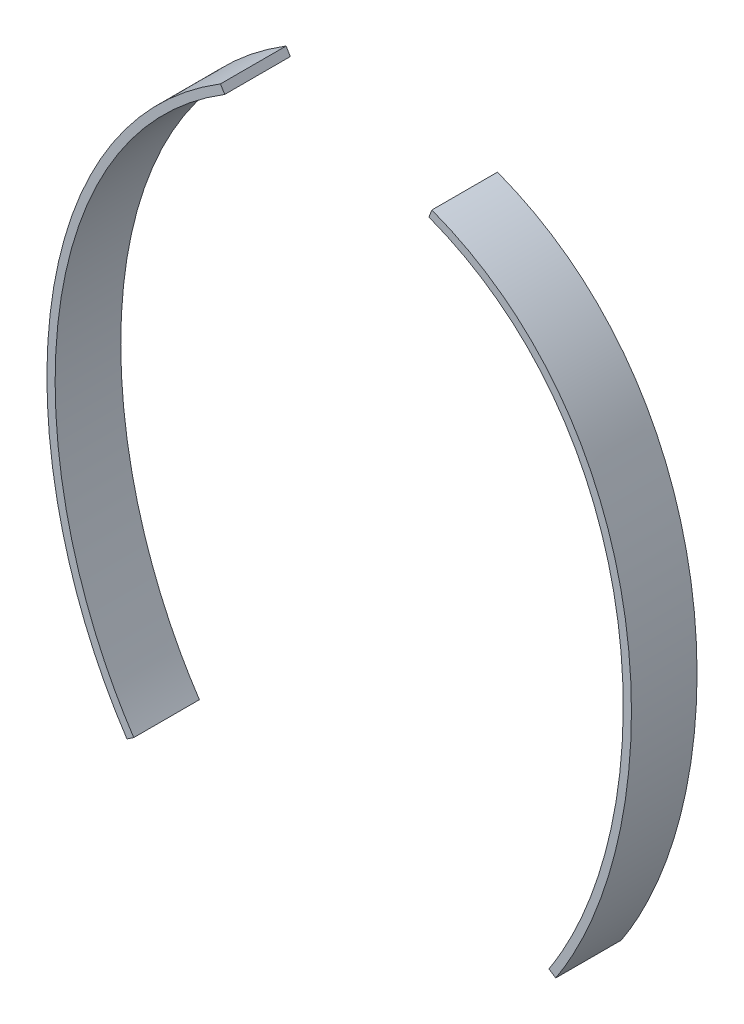
ISO-10303-21;
HEADER;
FILE_DESCRIPTION(('STEP AP214'),'2;1');
FILE_NAME('part.step','',(''),(''),'','','');
FILE_SCHEMA(('AUTOMOTIVE_DESIGN { 1 0 10303 214 1 1 1 1 }'));
ENDSEC;
DATA;
#1=APPLICATION_CONTEXT('core data for automotive mechanical design processes');
#2=APPLICATION_PROTOCOL_DEFINITION('international standard','automotive_design',2000,#1);
#3=PRODUCT_CONTEXT('',#1,'mechanical');
#4=PRODUCT('Part','Part','',(#3));
#5=PRODUCT_RELATED_PRODUCT_CATEGORY('part','',(#4));
#6=PRODUCT_DEFINITION_FORMATION('','',#4);
#7=PRODUCT_DEFINITION_CONTEXT('part definition',#1,'design');
#8=PRODUCT_DEFINITION('design','',#6,#7);
#9=PRODUCT_DEFINITION_SHAPE('','',#8);
#10=(LENGTH_UNIT() NAMED_UNIT(*) SI_UNIT(.MILLI.,.METRE.));
#11=(NAMED_UNIT(*) PLANE_ANGLE_UNIT() SI_UNIT($,.RADIAN.));
#12=(NAMED_UNIT(*) SI_UNIT($,.STERADIAN.) SOLID_ANGLE_UNIT());
#13=UNCERTAINTY_MEASURE_WITH_UNIT(LENGTH_MEASURE(1.E-05),#10,'distance_accuracy_value','');
#14=(GEOMETRIC_REPRESENTATION_CONTEXT(3) GLOBAL_UNCERTAINTY_ASSIGNED_CONTEXT((#13)) GLOBAL_UNIT_ASSIGNED_CONTEXT((#10,
#11,#12)) REPRESENTATION_CONTEXT('',''));
#15=CARTESIAN_POINT('',(0.,0.,0.));
#16=DIRECTION('',(0.,0.,1.));
#17=DIRECTION('',(1.,0.,0.));
#18=AXIS2_PLACEMENT_3D('',#15,#16,#17);
#19=CARTESIAN_POINT('',(21.9850501323743,52.8474394548477,201.));
#20=CARTESIAN_POINT('',(28.9641754913732,50.1960730306956,201.));
#21=CARTESIAN_POINT('',(35.0807872943287,46.6568559694011,201.));
#22=CARTESIAN_POINT('',(45.7290633469079,38.152328712859,201.));
#23=CARTESIAN_POINT('',(50.2613665562495,33.1854006876494,201.));
#24=CARTESIAN_POINT('',(57.8464524060081,22.1554386040819,201.));
#25=CARTESIAN_POINT('',(60.8981981202892,16.0918796897056,201.));
#26=CARTESIAN_POINT('',(65.5992221508379,3.22070987088875,201.));
#27=CARTESIAN_POINT('',(67.247969533013,-3.58648761186403,201.));
#28=CARTESIAN_POINT('',(70.2081637312982,-24.5654757786121,201.));
#29=CARTESIAN_POINT('',(69.5296472071106,-39.294325970111,201.));
#30=CARTESIAN_POINT('',(65.0805181526428,-60.2240674218553,201.));
#31=CARTESIAN_POINT('',(63.0264719985509,-67.0064996092342,201.));
#32=CARTESIAN_POINT('',(57.8786663488817,-79.8036423821645,201.));
#33=CARTESIAN_POINT('',(54.7848324065976,-85.8181336338963,201.));
#34=CARTESIAN_POINT('',(51.2269154824773,-91.2611666180093,201.));
#35=B_SPLINE_CURVE_WITH_KNOTS('',3,(#19,#20,#21,#22,#23,#24,#25,#26,#27,#28,#29,#30,#31,#32,#33,
#34),.UNSPECIFIED.,.F.,.F.,(4,2,2,2,2,2,2,4),(0.,0.125,0.25,0.375,0.5,0.75,0.875,1.),.UNSPECIFIED.);
#36=DIRECTION('',(0.,0.,-1.));
#37=VECTOR('',#36,1.);
#38=SURFACE_OF_LINEAR_EXTRUSION('',#35,#37);
#39=CARTESIAN_POINT('',(21.9850501323743,52.8474394548477,185.));
#40=CARTESIAN_POINT('',(28.9641754913732,50.1960730306956,185.));
#41=CARTESIAN_POINT('',(35.0807872943287,46.6568559694011,185.));
#42=CARTESIAN_POINT('',(45.7290633469079,38.152328712859,185.));
#43=CARTESIAN_POINT('',(50.2613665562495,33.1854006876494,185.));
#44=CARTESIAN_POINT('',(57.8464524060081,22.1554386040819,185.));
#45=CARTESIAN_POINT('',(60.8981981202892,16.0918796897056,185.));
#46=CARTESIAN_POINT('',(65.5992221508379,3.22070987088875,185.));
#47=CARTESIAN_POINT('',(67.247969533013,-3.58648761186403,185.));
#48=CARTESIAN_POINT('',(70.2081637312982,-24.5654757786121,185.));
#49=CARTESIAN_POINT('',(69.5296472071106,-39.294325970111,185.));
#50=CARTESIAN_POINT('',(65.0805181526428,-60.2240674218553,185.));
#51=CARTESIAN_POINT('',(63.0264719985509,-67.0064996092342,185.));
#52=CARTESIAN_POINT('',(57.8786663488817,-79.8036423821645,185.));
#53=CARTESIAN_POINT('',(54.7848324065976,-85.8181336338963,185.));
#54=CARTESIAN_POINT('',(51.2269154824773,-91.2611666180093,185.));
#55=B_SPLINE_CURVE_WITH_KNOTS('',3,(#39,#40,#41,#42,#43,#44,#45,#46,#47,#48,#49,#50,#51,#52,#53,
#54),.UNSPECIFIED.,.F.,.F.,(4,2,2,2,2,2,2,4),(0.,0.125,0.25,0.375,0.5,0.75,0.875,1.),.UNSPECIFIED.);
#56=CARTESIAN_POINT('',(21.9850501323743,52.8474394548477,185.));
#57=VERTEX_POINT('',#56);
#58=CARTESIAN_POINT('',(51.2269154824773,-91.2611666180093,185.));
#59=VERTEX_POINT('',#58);
#60=EDGE_CURVE('E124',#57,#59,#55,.T.);
#61=ORIENTED_EDGE('',*,*,#60,.T.);
#62=DIRECTION('',(0.,0.,-1.));
#63=VECTOR('',#62,1.);
#64=CARTESIAN_POINT('',(51.2269154824773,-91.2611666180093,201.));
#65=LINE('',#64,#63);
#66=CARTESIAN_POINT('',(51.2269154824773,-91.2611666180093,201.));
#67=VERTEX_POINT('',#66);
#68=EDGE_CURVE('E12',#67,#59,#65,.T.);
#69=ORIENTED_EDGE('',*,*,#68,.F.);
#70=CARTESIAN_POINT('',(21.9850501323743,52.8474394548477,201.));
#71=VERTEX_POINT('',#70);
#72=EDGE_CURVE('E85',#71,#67,#35,.T.);
#73=ORIENTED_EDGE('',*,*,#72,.F.);
#74=DIRECTION('',(0.,0.,-1.));
#75=VECTOR('',#74,1.);
#76=CARTESIAN_POINT('',(21.9850501323743,52.8474394548477,201.));
#77=LINE('',#76,#75);
#78=EDGE_CURVE('E61',#71,#57,#77,.T.);
#79=ORIENTED_EDGE('',*,*,#78,.T.);
#80=EDGE_LOOP('',(#61,#69,#73,#79));
#81=FACE_BOUND('',#80,.T.);
#82=ADVANCED_FACE('F44',(#81),#38,.F.);
#83=CARTESIAN_POINT('',(52.9009940572317,-92.355452195703,201.));
#84=DIRECTION('',(-0.547142788846836,-0.837039287377186,0.));
#85=DIRECTION('',(0.837039287377186,-0.547142788846836,0.));
#86=AXIS2_PLACEMENT_3D('',#83,#84,#85);
#87=PLANE('',#86);
#88=DIRECTION('',(-0.837039287377186,0.547142788846836,0.));
#89=VECTOR('',#88,1.);
#90=CARTESIAN_POINT('',(52.9009940572317,-92.355452195703,185.));
#91=LINE('',#90,#89);
#92=CARTESIAN_POINT('',(52.9009940572317,-92.355452195703,185.));
#93=VERTEX_POINT('',#92);
#94=EDGE_CURVE('E94',#93,#59,#91,.T.);
#95=ORIENTED_EDGE('',*,*,#94,.F.);
#96=DIRECTION('',(0.,0.,-1.));
#97=VECTOR('',#96,1.);
#98=CARTESIAN_POINT('',(52.9009940572317,-92.355452195703,201.));
#99=LINE('',#98,#97);
#100=CARTESIAN_POINT('',(52.9009940572317,-92.355452195703,201.));
#101=VERTEX_POINT('',#100);
#102=EDGE_CURVE('E53',#101,#93,#99,.T.);
#103=ORIENTED_EDGE('',*,*,#102,.F.);
#104=DIRECTION('',(-0.837039287377186,0.547142788846836,0.));
#105=VECTOR('',#104,1.);
#106=CARTESIAN_POINT('',(52.9009940572317,-92.355452195703,201.));
#107=LINE('',#106,#105);
#108=EDGE_CURVE('E92',#101,#67,#107,.T.);
#109=ORIENTED_EDGE('',*,*,#108,.T.);
#110=ORIENTED_EDGE('',*,*,#68,.T.);
#111=EDGE_LOOP('',(#95,#103,#109,#110));
#112=FACE_BOUND('',#111,.T.);
#113=ADVANCED_FACE('F91',(#112),#87,.T.);
#114=CARTESIAN_POINT('',(22.6953215064285,54.7170689837114,201.));
#115=CARTESIAN_POINT('',(80.0483874143488,32.9286663618312,201.));
#116=CARTESIAN_POINT('',(81.9930630964623,-47.8493283221736,201.));
#117=CARTESIAN_POINT('',(52.9009940572317,-92.355452195703,201.));
#118=B_SPLINE_CURVE_WITH_KNOTS('',3,(#114,#115,#116,#117),.UNSPECIFIED.,.F.,.F.,(4,4),(0.,1.),.UNSPECIFIED.);
#119=DIRECTION('',(0.,0.,-1.));
#120=VECTOR('',#119,1.);
#121=SURFACE_OF_LINEAR_EXTRUSION('',#118,#120);
#122=CARTESIAN_POINT('',(22.6953215064285,54.7170689837114,185.));
#123=CARTESIAN_POINT('',(80.0483874143488,32.9286663618312,185.));
#124=CARTESIAN_POINT('',(81.9930630964623,-47.8493283221736,185.));
#125=CARTESIAN_POINT('',(52.9009940572317,-92.355452195703,185.));
#126=B_SPLINE_CURVE_WITH_KNOTS('',3,(#122,#123,#124,#125),.UNSPECIFIED.,.F.,.F.,(4,4),(0.,1.),.UNSPECIFIED.);
#127=CARTESIAN_POINT('',(22.6953215064285,54.7170689837114,185.));
#128=VERTEX_POINT('',#127);
#129=EDGE_CURVE('E128',#128,#93,#126,.T.);
#130=ORIENTED_EDGE('',*,*,#129,.F.);
#131=DIRECTION('',(0.,0.,-1.));
#132=VECTOR('',#131,1.);
#133=CARTESIAN_POINT('',(22.6953215064285,54.7170689837114,201.));
#134=LINE('',#133,#132);
#135=CARTESIAN_POINT('',(22.6953215064285,54.7170689837114,201.));
#136=VERTEX_POINT('',#135);
#137=EDGE_CURVE('E74',#136,#128,#134,.T.);
#138=ORIENTED_EDGE('',*,*,#137,.F.);
#139=EDGE_CURVE('E100',#136,#101,#118,.T.);
#140=ORIENTED_EDGE('',*,*,#139,.T.);
#141=ORIENTED_EDGE('',*,*,#102,.T.);
#142=EDGE_LOOP('',(#130,#138,#140,#141));
#143=FACE_BOUND('',#142,.T.);
#144=ADVANCED_FACE('F102',(#143),#121,.T.);
#145=CARTESIAN_POINT('',(21.9850501323743,52.8474394548477,201.));
#146=DIRECTION('',(-0.93481476443186,0.355135687027094,0.));
#147=DIRECTION('',(-0.355135687027094,-0.93481476443186,0.));
#148=AXIS2_PLACEMENT_3D('',#145,#146,#147);
#149=PLANE('',#148);
#150=DIRECTION('',(0.355135687027094,0.93481476443186,0.));
#151=VECTOR('',#150,1.);
#152=CARTESIAN_POINT('',(21.9850501323743,52.8474394548477,185.));
#153=LINE('',#152,#151);
#154=EDGE_CURVE('E130',#57,#128,#153,.T.);
#155=ORIENTED_EDGE('',*,*,#154,.F.);
#156=ORIENTED_EDGE('',*,*,#78,.F.);
#157=DIRECTION('',(0.355135687027094,0.93481476443186,0.));
#158=VECTOR('',#157,1.);
#159=CARTESIAN_POINT('',(21.9850501323743,52.8474394548477,201.));
#160=LINE('',#159,#158);
#161=EDGE_CURVE('E103',#71,#136,#160,.T.);
#162=ORIENTED_EDGE('',*,*,#161,.T.);
#163=ORIENTED_EDGE('',*,*,#137,.T.);
#164=EDGE_LOOP('',(#155,#156,#162,#163));
#165=FACE_BOUND('',#164,.T.);
#166=ADVANCED_FACE('F116',(#165),#149,.T.);
#167=CARTESIAN_POINT('',(68.2347009324414,-10.5794836674467,201.));
#168=DIRECTION('',(0.,0.,1.));
#169=DIRECTION('',(1.,0.,0.));
#170=AXIS2_PLACEMENT_3D('',#167,#168,#169);
#171=PLANE('',#170);
#172=ORIENTED_EDGE('',*,*,#72,.T.);
#173=ORIENTED_EDGE('',*,*,#108,.F.);
#174=ORIENTED_EDGE('',*,*,#139,.F.);
#175=ORIENTED_EDGE('',*,*,#161,.F.);
#176=EDGE_LOOP('',(#172,#173,#174,#175));
#177=FACE_BOUND('',#176,.T.);
#178=ADVANCED_FACE('F99',(#177),#171,.T.);
#179=CARTESIAN_POINT('',(68.2347009324414,-10.5794836674467,185.));
#180=DIRECTION('',(0.,0.,1.));
#181=DIRECTION('',(1.,0.,0.));
#182=AXIS2_PLACEMENT_3D('',#179,#180,#181);
#183=PLANE('',#182);
#184=ORIENTED_EDGE('',*,*,#60,.F.);
#185=ORIENTED_EDGE('',*,*,#154,.T.);
#186=ORIENTED_EDGE('',*,*,#129,.T.);
#187=ORIENTED_EDGE('',*,*,#94,.T.);
#188=EDGE_LOOP('',(#184,#185,#186,#187));
#189=FACE_BOUND('',#188,.T.);
#190=ADVANCED_FACE('F127',(#189),#183,.F.);
#191=CLOSED_SHELL('',(#82,#113,#144,#166,#178,#190));
#192=MANIFOLD_SOLID_BREP('B2',#191);
#193=CARTESIAN_POINT('',(-28.853664661854,55.5693583018992,201.));
#194=CARTESIAN_POINT('',(-35.1460707004315,51.7075558295574,201.));
#195=CARTESIAN_POINT('',(-40.6957531502358,47.1718909901913,201.));
#196=CARTESIAN_POINT('',(-50.3584975719317,37.0386814041266,201.));
#197=CARTESIAN_POINT('',(-54.4716007732342,31.4414190648141,201.));
#198=CARTESIAN_POINT('',(-64.7423828096153,13.4865315835598,201.));
#199=CARTESIAN_POINT('',(-68.8323233052979,-0.0317856282646164,201.));
#200=CARTESIAN_POINT('',(-71.9935663248483,-27.9362420355474,201.));
#201=CARTESIAN_POINT('',(-71.0658306226076,-42.3244429018897,201.));
#202=CARTESIAN_POINT('',(-64.6630165383583,-69.7782561552852,201.));
#203=CARTESIAN_POINT('',(-59.187786489102,-82.8451431567908,201.));
#204=CARTESIAN_POINT('',(-51.6567659043465,-94.1492252283117,201.));
#205=B_SPLINE_CURVE_WITH_KNOTS('',3,(#193,#194,#195,#196,#197,#198,#199,#200,#201,#202,#203,
#204),.UNSPECIFIED.,.F.,.F.,(4,2,2,2,2,4),(0.,0.125,0.25,0.5,0.75,1.),.UNSPECIFIED.);
#206=DIRECTION('',(0.,0.,-1.));
#207=VECTOR('',#206,1.);
#208=SURFACE_OF_LINEAR_EXTRUSION('',#205,#207);
#209=CARTESIAN_POINT('',(-28.853664661854,55.5693583018992,185.));
#210=CARTESIAN_POINT('',(-35.1460707004315,51.7075558295574,185.));
#211=CARTESIAN_POINT('',(-40.6957531502358,47.1718909901913,185.));
#212=CARTESIAN_POINT('',(-50.3584975719317,37.0386814041266,185.));
#213=CARTESIAN_POINT('',(-54.4716007732342,31.4414190648141,185.));
#214=CARTESIAN_POINT('',(-64.7423828096153,13.4865315835598,185.));
#215=CARTESIAN_POINT('',(-68.8323233052979,-0.0317856282646164,185.));
#216=CARTESIAN_POINT('',(-71.9935663248483,-27.9362420355474,185.));
#217=CARTESIAN_POINT('',(-71.0658306226076,-42.3244429018897,185.));
#218=CARTESIAN_POINT('',(-64.6630165383583,-69.7782561552852,185.));
#219=CARTESIAN_POINT('',(-59.187786489102,-82.8451431567908,185.));
#220=CARTESIAN_POINT('',(-51.6567659043465,-94.1492252283117,185.));
#221=B_SPLINE_CURVE_WITH_KNOTS('',3,(#209,#210,#211,#212,#213,#214,#215,#216,#217,#218,#219,
#220),.UNSPECIFIED.,.F.,.F.,(4,2,2,2,2,4),(0.,0.125,0.25,0.5,0.75,1.),.UNSPECIFIED.);
#222=CARTESIAN_POINT('',(-28.853664661854,55.5693583018992,185.));
#223=VERTEX_POINT('',#222);
#224=CARTESIAN_POINT('',(-51.6567659043465,-94.1492252283117,185.));
#225=VERTEX_POINT('',#224);
#226=EDGE_CURVE('E269',#223,#225,#221,.T.);
#227=ORIENTED_EDGE('',*,*,#226,.T.);
#228=DIRECTION('',(0.,0.,-1.));
#229=VECTOR('',#228,1.);
#230=CARTESIAN_POINT('',(-51.6567659043465,-94.1492252283117,201.));
#231=LINE('',#230,#229);
#232=CARTESIAN_POINT('',(-51.6567659043465,-94.1492252283117,201.));
#233=VERTEX_POINT('',#232);
#234=EDGE_CURVE('E42',#233,#225,#231,.T.);
#235=ORIENTED_EDGE('',*,*,#234,.F.);
#236=CARTESIAN_POINT('',(-28.853664661854,55.5693583018992,201.));
#237=VERTEX_POINT('',#236);
#238=EDGE_CURVE('E230',#237,#233,#205,.T.);
#239=ORIENTED_EDGE('',*,*,#238,.F.);
#240=DIRECTION('',(0.,0.,-1.));
#241=VECTOR('',#240,1.);
#242=CARTESIAN_POINT('',(-28.853664661854,55.5693583018992,201.));
#243=LINE('',#242,#241);
#244=EDGE_CURVE('E206',#237,#223,#243,.T.);
#245=ORIENTED_EDGE('',*,*,#244,.T.);
#246=EDGE_LOOP('',(#227,#235,#239,#245));
#247=FACE_BOUND('',#246,.T.);
#248=ADVANCED_FACE('F189',(#247),#208,.F.);
#249=CARTESIAN_POINT('',(-49.9923232847578,-93.0403380536646,201.));
#250=DIRECTION('',(0.554443587323511,-0.832221309794358,0.));
#251=DIRECTION('',(0.832221309794358,0.554443587323511,0.));
#252=AXIS2_PLACEMENT_3D('',#249,#250,#251);
#253=PLANE('',#252);
#254=DIRECTION('',(-0.832221309794358,-0.554443587323511,0.));
#255=VECTOR('',#254,1.);
#256=CARTESIAN_POINT('',(-49.9923232847578,-93.0403380536646,185.));
#257=LINE('',#256,#255);
#258=CARTESIAN_POINT('',(-49.9923232847578,-93.0403380536646,185.));
#259=VERTEX_POINT('',#258);
#260=EDGE_CURVE('E239',#259,#225,#257,.T.);
#261=ORIENTED_EDGE('',*,*,#260,.F.);
#262=DIRECTION('',(0.,0.,-1.));
#263=VECTOR('',#262,1.);
#264=CARTESIAN_POINT('',(-49.9923232847578,-93.0403380536646,201.));
#265=LINE('',#264,#263);
#266=CARTESIAN_POINT('',(-49.9923232847578,-93.0403380536646,201.));
#267=VERTEX_POINT('',#266);
#268=EDGE_CURVE('E198',#267,#259,#265,.T.);
#269=ORIENTED_EDGE('',*,*,#268,.F.);
#270=DIRECTION('',(-0.832221309794358,-0.554443587323511,0.));
#271=VECTOR('',#270,1.);
#272=CARTESIAN_POINT('',(-49.9923232847578,-93.0403380536646,201.));
#273=LINE('',#272,#271);
#274=EDGE_CURVE('E237',#267,#233,#273,.T.);
#275=ORIENTED_EDGE('',*,*,#274,.T.);
#276=ORIENTED_EDGE('',*,*,#234,.T.);
#277=EDGE_LOOP('',(#261,#269,#275,#276));
#278=FACE_BOUND('',#277,.T.);
#279=ADVANCED_FACE('F236',(#278),#253,.T.);
#280=CARTESIAN_POINT('',(-27.8075233365963,53.8647796655236,201.));
#281=CARTESIAN_POINT('',(-33.9517879811374,50.0938951660905,201.));
#282=CARTESIAN_POINT('',(-39.3647716227417,45.6695748533882,201.));
#283=CARTESIAN_POINT('',(-48.7946497567085,35.7805694805478,201.));
#284=CARTESIAN_POINT('',(-52.8115030196604,30.3156020130236,201.));
#285=CARTESIAN_POINT('',(-62.8544752697104,12.758960650343,201.));
#286=CARTESIAN_POINT('',(-66.8722174898729,-0.496860598355512,201.));
#287=CARTESIAN_POINT('',(-69.9790960685913,-27.9214392613699,201.));
#288=CARTESIAN_POINT('',(-69.0672706532558,-42.0881350048019,201.));
#289=CARTESIAN_POINT('',(-62.7661151190613,-69.1060594736583,201.));
#290=CARTESIAN_POINT('',(-57.3769366674502,-81.9560135846303,201.));
#291=CARTESIAN_POINT('',(-49.9923232847578,-93.0403380536646,201.));
#292=B_SPLINE_CURVE_WITH_KNOTS('',3,(#280,#281,#282,#283,#284,#285,#286,#287,#288,#289,#290,
#291),.UNSPECIFIED.,.F.,.F.,(4,2,2,2,2,4),(0.,0.125,0.25,0.5,0.75,1.),.UNSPECIFIED.);
#293=DIRECTION('',(0.,0.,-1.));
#294=VECTOR('',#293,1.);
#295=SURFACE_OF_LINEAR_EXTRUSION('',#292,#294);
#296=CARTESIAN_POINT('',(-27.8075233365963,53.8647796655236,185.));
#297=CARTESIAN_POINT('',(-33.9517879811374,50.0938951660905,185.));
#298=CARTESIAN_POINT('',(-39.3647716227417,45.6695748533882,185.));
#299=CARTESIAN_POINT('',(-48.7946497567085,35.7805694805478,185.));
#300=CARTESIAN_POINT('',(-52.8115030196604,30.3156020130236,185.));
#301=CARTESIAN_POINT('',(-62.8544752697104,12.758960650343,185.));
#302=CARTESIAN_POINT('',(-66.8722174898729,-0.496860598355512,185.));
#303=CARTESIAN_POINT('',(-69.9790960685913,-27.9214392613699,185.));
#304=CARTESIAN_POINT('',(-69.0672706532558,-42.0881350048019,185.));
#305=CARTESIAN_POINT('',(-62.7661151190613,-69.1060594736583,185.));
#306=CARTESIAN_POINT('',(-57.3769366674502,-81.9560135846303,185.));
#307=CARTESIAN_POINT('',(-49.9923232847578,-93.0403380536646,185.));
#308=B_SPLINE_CURVE_WITH_KNOTS('',3,(#296,#297,#298,#299,#300,#301,#302,#303,#304,#305,#306,
#307),.UNSPECIFIED.,.F.,.F.,(4,2,2,2,2,4),(0.,0.125,0.25,0.5,0.75,1.),.UNSPECIFIED.);
#309=CARTESIAN_POINT('',(-27.8075233365963,53.8647796655236,185.));
#310=VERTEX_POINT('',#309);
#311=EDGE_CURVE('E273',#310,#259,#308,.T.);
#312=ORIENTED_EDGE('',*,*,#311,.F.);
#313=DIRECTION('',(0.,0.,-1.));
#314=VECTOR('',#313,1.);
#315=CARTESIAN_POINT('',(-27.8075233365963,53.8647796655236,201.));
#316=LINE('',#315,#314);
#317=CARTESIAN_POINT('',(-27.8075233365963,53.8647796655236,201.));
#318=VERTEX_POINT('',#317);
#319=EDGE_CURVE('E219',#318,#310,#316,.T.);
#320=ORIENTED_EDGE('',*,*,#319,.F.);
#321=EDGE_CURVE('E245',#318,#267,#292,.T.);
#322=ORIENTED_EDGE('',*,*,#321,.T.);
#323=ORIENTED_EDGE('',*,*,#268,.T.);
#324=EDGE_LOOP('',(#312,#320,#322,#323));
#325=FACE_BOUND('',#324,.T.);
#326=ADVANCED_FACE('F247',(#325),#295,.T.);
#327=CARTESIAN_POINT('',(-28.853664661854,55.5693583018992,201.));
#328=DIRECTION('',(0.852289318187822,0.523070662628806,0.));
#329=DIRECTION('',(-0.523070662628806,0.852289318187822,0.));
#330=AXIS2_PLACEMENT_3D('',#327,#328,#329);
#331=PLANE('',#330);
#332=DIRECTION('',(0.523070662628806,-0.852289318187822,0.));
#333=VECTOR('',#332,1.);
#334=CARTESIAN_POINT('',(-28.853664661854,55.5693583018992,185.));
#335=LINE('',#334,#333);
#336=EDGE_CURVE('E275',#223,#310,#335,.T.);
#337=ORIENTED_EDGE('',*,*,#336,.F.);
#338=ORIENTED_EDGE('',*,*,#244,.F.);
#339=DIRECTION('',(0.523070662628806,-0.852289318187822,0.));
#340=VECTOR('',#339,1.);
#341=CARTESIAN_POINT('',(-28.853664661854,55.5693583018992,201.));
#342=LINE('',#341,#340);
#343=EDGE_CURVE('E248',#237,#318,#342,.T.);
#344=ORIENTED_EDGE('',*,*,#343,.T.);
#345=ORIENTED_EDGE('',*,*,#319,.T.);
#346=EDGE_LOOP('',(#337,#338,#344,#345));
#347=FACE_BOUND('',#346,.T.);
#348=ADVANCED_FACE('F261',(#347),#331,.T.);
#349=CARTESIAN_POINT('',(-70.4129448150731,-13.984013831906,201.));
#350=DIRECTION('',(0.,0.,-1.));
#351=DIRECTION('',(-1.,0.,0.));
#352=AXIS2_PLACEMENT_3D('',#349,#350,#351);
#353=PLANE('',#352);
#354=ORIENTED_EDGE('',*,*,#238,.T.);
#355=ORIENTED_EDGE('',*,*,#274,.F.);
#356=ORIENTED_EDGE('',*,*,#321,.F.);
#357=ORIENTED_EDGE('',*,*,#343,.F.);
#358=EDGE_LOOP('',(#354,#355,#356,#357));
#359=FACE_BOUND('',#358,.T.);
#360=ADVANCED_FACE('F244',(#359),#353,.F.);
#361=CARTESIAN_POINT('',(-70.4129448150731,-13.984013831906,185.));
#362=DIRECTION('',(0.,0.,-1.));
#363=DIRECTION('',(-1.,0.,0.));
#364=AXIS2_PLACEMENT_3D('',#361,#362,#363);
#365=PLANE('',#364);
#366=ORIENTED_EDGE('',*,*,#226,.F.);
#367=ORIENTED_EDGE('',*,*,#336,.T.);
#368=ORIENTED_EDGE('',*,*,#311,.T.);
#369=ORIENTED_EDGE('',*,*,#260,.T.);
#370=EDGE_LOOP('',(#366,#367,#368,#369));
#371=FACE_BOUND('',#370,.T.);
#372=ADVANCED_FACE('F272',(#371),#365,.T.);
#373=CLOSED_SHELL('',(#248,#279,#326,#348,#360,#372));
#374=MANIFOLD_SOLID_BREP('B6',#373);
#375=ADVANCED_BREP_SHAPE_REPRESENTATION('',(#18,#192,#374),#14);
#376=SHAPE_DEFINITION_REPRESENTATION(#9,#375);
ENDSEC;
END-ISO-10303-21;
